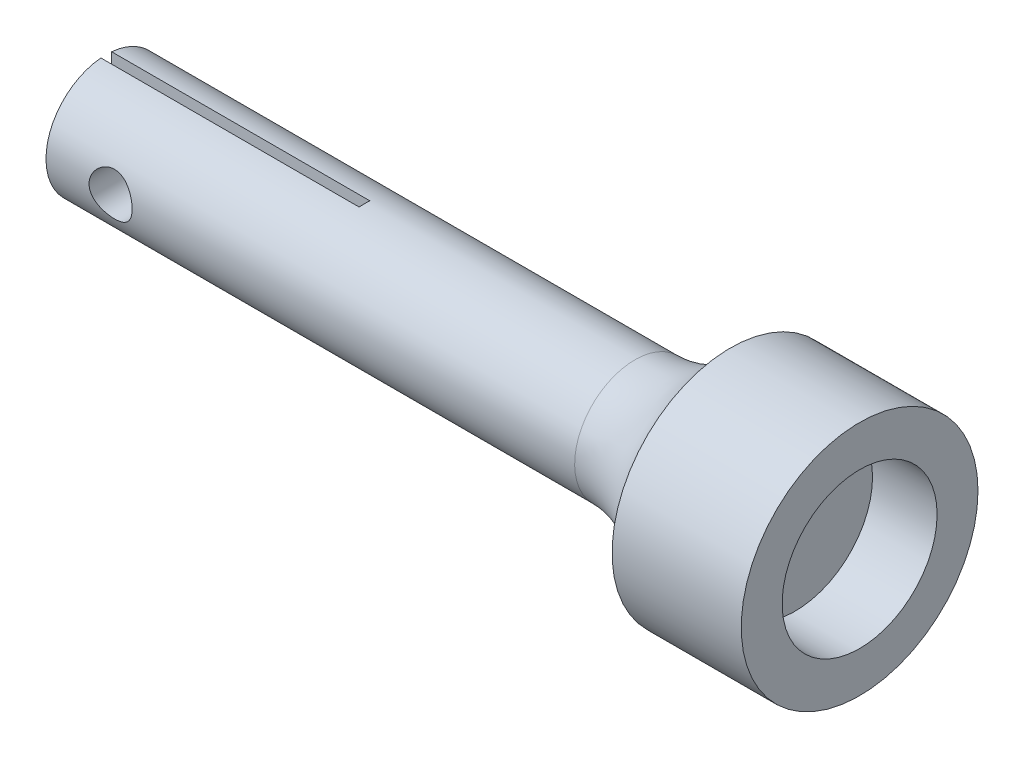
ISO-10303-21;
HEADER;
FILE_DESCRIPTION(('STEP AP214'),'2;1');
FILE_NAME('part.step','',(''),(''),'','','');
FILE_SCHEMA(('AUTOMOTIVE_DESIGN { 1 0 10303 214 1 1 1 1 }'));
ENDSEC;
DATA;
#1=APPLICATION_CONTEXT('core data for automotive mechanical design processes');
#2=APPLICATION_PROTOCOL_DEFINITION('international standard','automotive_design',2000,#1);
#3=PRODUCT_CONTEXT('',#1,'mechanical');
#4=PRODUCT('Part','Part','',(#3));
#5=PRODUCT_RELATED_PRODUCT_CATEGORY('part','',(#4));
#6=PRODUCT_DEFINITION_FORMATION('','',#4);
#7=PRODUCT_DEFINITION_CONTEXT('part definition',#1,'design');
#8=PRODUCT_DEFINITION('design','',#6,#7);
#9=PRODUCT_DEFINITION_SHAPE('','',#8);
#10=(LENGTH_UNIT() NAMED_UNIT(*) SI_UNIT(.MILLI.,.METRE.));
#11=(NAMED_UNIT(*) PLANE_ANGLE_UNIT() SI_UNIT($,.RADIAN.));
#12=(NAMED_UNIT(*) SI_UNIT($,.STERADIAN.) SOLID_ANGLE_UNIT());
#13=UNCERTAINTY_MEASURE_WITH_UNIT(LENGTH_MEASURE(1.E-05),#10,'distance_accuracy_value','');
#14=(GEOMETRIC_REPRESENTATION_CONTEXT(3) GLOBAL_UNCERTAINTY_ASSIGNED_CONTEXT((#13)) GLOBAL_UNIT_ASSIGNED_CONTEXT((#10,
#11,#12)) REPRESENTATION_CONTEXT('',''));
#15=CARTESIAN_POINT('',(0.,0.,0.));
#16=DIRECTION('',(0.,0.,1.));
#17=DIRECTION('',(1.,0.,0.));
#18=AXIS2_PLACEMENT_3D('',#15,#16,#17);
#19=CARTESIAN_POINT('',(35.,0.,0.));
#20=DIRECTION('',(-1.,0.,0.));
#21=DIRECTION('',(0.,0.,1.));
#22=AXIS2_PLACEMENT_3D('',#19,#20,#21);
#23=CYLINDRICAL_SURFACE('',#22,2.8);
#24=CARTESIAN_POINT('',(24.5604054239154,0.,0.));
#25=DIRECTION('',(1.,0.,0.));
#26=DIRECTION('',(0.,0.,-1.));
#27=AXIS2_PLACEMENT_3D('',#24,#25,#26);
#28=CIRCLE('',#27,2.8);
#29=CARTESIAN_POINT('',(24.5604054239154,0.,-2.8));
#30=VERTEX_POINT('',#29);
#31=EDGE_CURVE('E11',#30,#30,#28,.F.);
#32=ORIENTED_EDGE('',*,*,#31,.T.);
#33=EDGE_LOOP('',(#32));
#34=FACE_BOUND('',#33,.T.);
#35=CARTESIAN_POINT('',(3.99998436731162,0.,2.8));
#36=CARTESIAN_POINT('',(3.99968157578981,0.0543518119068014,2.80000081043461));
#37=CARTESIAN_POINT('',(3.99493120221083,0.108670745661306,2.79840329592013));
#38=CARTESIAN_POINT('',(3.97672801849134,0.215645712216397,2.79219764095074));
#39=CARTESIAN_POINT('',(3.96327549478635,0.268301799690549,2.78758959958872));
#40=CARTESIAN_POINT('',(3.92819384891246,0.370394931912321,2.77586854098101));
#41=CARTESIAN_POINT('',(3.90657965010624,0.419837659940304,2.76876009725596));
#42=CARTESIAN_POINT('',(3.85585668852286,0.514398858125232,2.75276162507002));
#43=CARTESIAN_POINT('',(3.82674613482375,0.55951629140507,2.74387117098934));
#44=CARTESIAN_POINT('',(3.76066402140487,0.645907642509414,2.72485405532113));
#45=CARTESIAN_POINT('',(3.72345164304428,0.686990148342238,2.71469487592134));
#46=CARTESIAN_POINT('',(3.64274444972359,0.7624801646494,2.69446733401479));
#47=CARTESIAN_POINT('',(3.5992480098622,0.796885943280569,2.68439899571488));
#48=CARTESIAN_POINT('',(3.50545226801035,0.859156411176013,2.66513603303571));
#49=CARTESIAN_POINT('',(3.45497587960342,0.886767867145321,2.65598118983054));
#50=CARTESIAN_POINT('',(3.34971586374519,0.933024564142187,2.64008862734095));
#51=CARTESIAN_POINT('',(3.2949338056644,0.951673054602365,2.63335003229552));
#52=CARTESIAN_POINT('',(3.18482701109028,0.978750063757841,2.6234043590176));
#53=CARTESIAN_POINT('',(3.12960353912714,0.987542875913959,2.62007183170028));
#54=CARTESIAN_POINT('',(3.01837248241966,0.99579233987817,2.61694844898499));
#55=CARTESIAN_POINT('',(2.9623651799449,0.995252270343698,2.61715634982812));
#56=CARTESIAN_POINT('',(2.85426317791202,0.985142713386496,2.62097654024214));
#57=CARTESIAN_POINT('',(2.80211686969965,0.976046119010187,2.6244105218601));
#58=CARTESIAN_POINT('',(2.70014348343635,0.949844721604288,2.63400601511798));
#59=CARTESIAN_POINT('',(2.65031673247883,0.932738792873097,2.64016791015597));
#60=CARTESIAN_POINT('',(2.55329801448022,0.89068208239375,2.654653746742));
#61=CARTESIAN_POINT('',(2.50617383708684,0.865588835045947,2.66301643249626));
#62=CARTESIAN_POINT('',(2.41665649131316,0.808370693938972,2.68093898406977));
#63=CARTESIAN_POINT('',(2.37426484973599,0.776243540754123,2.69049923414651));
#64=CARTESIAN_POINT('',(2.29275733225226,0.703606626544134,2.71043104768284));
#65=CARTESIAN_POINT('',(2.25398808474001,0.662710940135138,2.72081697384839));
#66=CARTESIAN_POINT('',(2.18376603857555,0.574860521164818,2.74072281614158));
#67=CARTESIAN_POINT('',(2.15231405665551,0.527905113143283,2.75024263552472));
#68=CARTESIAN_POINT('',(2.09734720948402,0.42854537729866,2.76747452658368));
#69=CARTESIAN_POINT('',(2.07392288871241,0.37608708467373,2.7751656942555));
#70=CARTESIAN_POINT('',(2.03634125488208,0.267633217083857,2.78771343248954));
#71=CARTESIAN_POINT('',(2.0221801973454,0.211639081457782,2.79257114832853));
#72=CARTESIAN_POINT('',(2.00415353730186,0.100673601060613,2.79871390692993));
#73=CARTESIAN_POINT('',(1.99981427554316,0.0457881847062376,2.8001634537073));
#74=CARTESIAN_POINT('',(2.00019784579704,-0.0639343979763133,2.79980714582579));
#75=CARTESIAN_POINT('',(2.00491898758018,-0.118771571395,2.79800189835659));
#76=CARTESIAN_POINT('',(2.02292355074018,-0.224974275261234,2.79143829309317));
#77=CARTESIAN_POINT('',(2.03592245760996,-0.276394698132204,2.78677825220942));
#78=CARTESIAN_POINT('',(2.0697521692062,-0.376295465146108,2.77505557771295));
#79=CARTESIAN_POINT('',(2.09058404277718,-0.424775406997891,2.76799261622313));
#80=CARTESIAN_POINT('',(2.14017201793885,-0.519026721666987,2.75190227512569));
#81=CARTESIAN_POINT('',(2.16914544761825,-0.564674590196989,2.74282270066413));
#82=CARTESIAN_POINT('',(2.23393707492221,-0.650607526814779,2.72372002562964));
#83=CARTESIAN_POINT('',(2.26975765177193,-0.690890722523309,2.71369659770556));
#84=CARTESIAN_POINT('',(2.34944214106111,-0.767150514500904,2.69316200711302));
#85=CARTESIAN_POINT('',(2.39362909734386,-0.802790980560569,2.68265279959909));
#86=CARTESIAN_POINT('',(2.48758799513525,-0.86619929414364,2.6628566675319));
#87=CARTESIAN_POINT('',(2.53736011997637,-0.893966883135238,2.65356978312299));
#88=CARTESIAN_POINT('',(2.64119541192047,-0.94073720528036,2.63735271703636));
#89=CARTESIAN_POINT('',(2.69525529384486,-0.959746574173525,2.63042075218332));
#90=CARTESIAN_POINT('',(2.80612159159094,-0.988283134810869,2.61983450328631));
#91=CARTESIAN_POINT('',(2.86292648084232,-0.997815534732862,2.61617841905353));
#92=CARTESIAN_POINT('',(2.97401495160832,-1.00671231476979,2.61276682213714));
#93=CARTESIAN_POINT('',(3.02824636354494,-1.00665024662565,2.61279128594208));
#94=CARTESIAN_POINT('',(3.13587826002966,-0.997787201123977,2.61618858762092));
#95=CARTESIAN_POINT('',(3.18927880092506,-0.988986819020572,2.61956119741903));
#96=CARTESIAN_POINT('',(3.2924542653526,-0.963313124287915,2.62910770204166));
#97=CARTESIAN_POINT('',(3.34228533998463,-0.946637795558853,2.63521271480446));
#98=CARTESIAN_POINT('',(3.43848046423913,-0.905850429298398,2.64950935707435));
#99=CARTESIAN_POINT('',(3.48484366134394,-0.881736570549992,2.657701497499));
#100=CARTESIAN_POINT('',(3.57530567367231,-0.825350416750248,2.67576415422859));
#101=CARTESIAN_POINT('',(3.61917464255774,-0.792729886203392,2.68569819837434));
#102=CARTESIAN_POINT('',(3.70099773474347,-0.720832904312137,2.70588113223213));
#103=CARTESIAN_POINT('',(3.73895005495113,-0.681554431548912,2.71613011678726));
#104=CARTESIAN_POINT('',(3.80967081227761,-0.595243021600092,2.73637316790833));
#105=CARTESIAN_POINT('',(3.84211149213592,-0.547932261709247,2.74633257460409));
#106=CARTESIAN_POINT('',(3.89855221977458,-0.448182174445977,2.76436212124485));
#107=CARTESIAN_POINT('',(3.92255299527647,-0.395743289739085,2.77243242405569));
#108=CARTESIAN_POINT('',(3.96131269372733,-0.287042377529552,2.78578705111332));
#109=CARTESIAN_POINT('',(3.9760469832864,-0.230770596813872,2.79106394371281));
#110=CARTESIAN_POINT('',(3.99554284513281,-0.116319506472419,2.79816931898325));
#111=CARTESIAN_POINT('',(4.00030826790924,-0.0581409421668658,2.79999913306604));
#112=CARTESIAN_POINT('',(3.99998436731162,0.,2.8));
#113=B_SPLINE_CURVE_WITH_KNOTS('',3,(#35,#36,#37,#38,#39,#40,#41,#42,#43,#44,#45,#46,#47,#48,
#49,#50,#51,#52,#53,#54,#55,#56,#57,#58,#59,#60,#61,#62,#63,#64,#65,#66,#67,#68,#69,#70,#71,#72,
#73,#74,#75,#76,#77,#78,#79,#80,#81,#82,#83,#84,#85,#86,#87,#88,#89,#90,#91,#92,#93,#94,#95,#96,
#97,#98,#99,#100,#101,#102,#103,#104,#105,#106,#107,#108,#109,#110,#111,#112),.UNSPECIFIED.,.T.,
.F.,(4,2,2,2,2,2,2,2,2,2,2,2,2,2,2,2,2,2,2,2,2,2,2,2,2,2,2,2,2,2,2,2,2,2,2,2,2,2,4),(0.,
0.162843557305116,0.325681754807981,0.488223638394486,0.650804390248843,0.819113031204537,
0.987465270721624,1.16137140415672,1.33521444203292,1.50239486537706,1.66951655914443,
1.82791292177261,1.98633155349074,2.14775108278828,2.30922253941272,2.48033340734969,
2.6514633650372,2.82446445545257,2.9973955705552,3.16179123869065,3.32615624159304,
3.4851561495556,3.64417776166905,3.807930738127,3.97174071872958,4.14413158406509,
4.31652810976606,4.48879380210899,4.66096477143157,4.8228476897164,4.98471958128999,
5.14272246794914,5.3007640700862,5.46672421328524,5.63273483421593,5.80655322867135,
5.98035663214837,6.15462013111838,6.32881630812455),.UNSPECIFIED.);
#114=CARTESIAN_POINT('',(3.99998436731162,0.,2.8));
#115=VERTEX_POINT('',#114);
#116=EDGE_CURVE('E96',#115,#115,#113,.T.);
#117=ORIENTED_EDGE('',*,*,#116,.F.);
#118=EDGE_LOOP('',(#117));
#119=FACE_BOUND('',#118,.T.);
#120=CARTESIAN_POINT('',(3.,-1.00559152326157,-2.61319453702637));
#121=CARTESIAN_POINT('',(2.94581583625714,-1.00559270417088,-2.61319350172991));
#122=CARTESIAN_POINT('',(2.89163980981088,-1.0011728147267,-2.61490763309015));
#123=CARTESIAN_POINT('',(2.78490961253958,-0.983681867070271,-2.62153695344931));
#124=CARTESIAN_POINT('',(2.73235552558098,-0.970610362286356,-2.62645230768602));
#125=CARTESIAN_POINT('',(2.63043727910103,-0.936348777699535,-2.63885935029053));
#126=CARTESIAN_POINT('',(2.58106631483222,-0.915176736101611,-2.6463453106857));
#127=CARTESIAN_POINT('',(2.48655969014907,-0.865378722993564,-2.66304469726641));
#128=CARTESIAN_POINT('',(2.44142517396796,-0.836750745526424,-2.67225858815012));
#129=CARTESIAN_POINT('',(2.35462013812696,-0.771460142820544,-2.69184985809865));
#130=CARTESIAN_POINT('',(2.31316981183983,-0.734514402936533,-2.70225958128236));
#131=CARTESIAN_POINT('',(2.23690015737999,-0.654240023266012,-2.72280826557513));
#132=CARTESIAN_POINT('',(2.20208210853297,-0.610910154873144,-2.73294717412207));
#133=CARTESIAN_POINT('',(2.13901665355336,-0.517434282381749,-2.75220011140442));
#134=CARTESIAN_POINT('',(2.11100781331546,-0.467117949852621,-2.7612723570996));
#135=CARTESIAN_POINT('',(2.06394225927365,-0.362107127486806,-2.77699323559544));
#136=CARTESIAN_POINT('',(2.04488276437741,-0.307414003970724,-2.78364262117836));
#137=CARTESIAN_POINT('',(2.01701242918521,-0.197484492534624,-2.79355044094607));
#138=CARTESIAN_POINT('',(2.00782777354089,-0.142354193926773,-2.79693202708521));
#139=CARTESIAN_POINT('',(1.99877729289326,-0.0312377196610274,-2.80037677712182));
#140=CARTESIAN_POINT('',(1.99890868022344,0.0247481949550353,-2.80044093369342));
#141=CARTESIAN_POINT('',(2.00826096500762,0.133282843918552,-2.79732935366024));
#142=CARTESIAN_POINT('',(2.01706858719283,0.185872168615696,-2.79430069703106));
#143=CARTESIAN_POINT('',(2.04283603404691,0.288773892081078,-2.78554796736443));
#144=CARTESIAN_POINT('',(2.05979640643675,0.339086137621256,-2.77982371323091));
#145=CARTESIAN_POINT('',(2.10158648082716,0.436806186236417,-2.76616507114798));
#146=CARTESIAN_POINT('',(2.12651861857964,0.484166017280522,-2.75820208633761));
#147=CARTESIAN_POINT('',(2.18345639759157,0.574144066234325,-2.74088690814369));
#148=CARTESIAN_POINT('',(2.21546417684764,0.616760845105184,-2.73153429514665));
#149=CARTESIAN_POINT('',(2.28763997527333,0.698446229897507,-2.71183187226936));
#150=CARTESIAN_POINT('',(2.32815168295294,0.737205196358174,-2.70145548159697));
#151=CARTESIAN_POINT('',(2.41516997071013,0.807490780085563,-2.68128678808209));
#152=CARTESIAN_POINT('',(2.4616777796901,0.839015911083988,-2.67149460557665));
#153=CARTESIAN_POINT('',(2.560501642775,0.894469482740631,-2.65344941366636));
#154=CARTESIAN_POINT('',(2.61291038601647,0.918244110773872,-2.64522876965292));
#155=CARTESIAN_POINT('',(2.72135430606839,0.956519953145428,-2.63163201231884));
#156=CARTESIAN_POINT('',(2.77738770278769,0.971025681992695,-2.62625451443638));
#157=CARTESIAN_POINT('',(2.88848465203628,0.989685552010179,-2.61927802723335));
#158=CARTESIAN_POINT('',(2.94345611510576,0.994321963840302,-2.61750320830803));
#159=CARTESIAN_POINT('',(3.05340854706268,0.994492532208805,-2.61743871113679));
#160=CARTESIAN_POINT('',(3.10838951131316,0.990028659797159,-2.61914827820025));
#161=CARTESIAN_POINT('',(3.21443819750368,0.972563142392776,-2.62568097412891));
#162=CARTESIAN_POINT('',(3.26557388995844,0.959919783572844,-2.63037330504923));
#163=CARTESIAN_POINT('',(3.36498124362321,0.926896175180284,-2.64219016449614));
#164=CARTESIAN_POINT('',(3.41325235268755,0.906514439607749,-2.64931516014066));
#165=CARTESIAN_POINT('',(3.50741989871313,0.857792843182706,-2.66549625668178));
#166=CARTESIAN_POINT('',(3.55317586130003,0.829201433422258,-2.67461077536913));
#167=CARTESIAN_POINT('',(3.63941497507502,0.765145681149404,-2.69363449446803));
#168=CARTESIAN_POINT('',(3.67989636462694,0.729679052195342,-2.70354395860439));
#169=CARTESIAN_POINT('',(3.75677634599647,0.650533012879929,-2.72370389099987));
#170=CARTESIAN_POINT('',(3.79282110874337,0.606505777201771,-2.73394253594371));
#171=CARTESIAN_POINT('',(3.85704438339149,0.51277296595146,-2.75306166446986));
#172=CARTESIAN_POINT('',(3.88522305893423,0.463067508536061,-2.76194217630425));
#173=CARTESIAN_POINT('',(3.93267869901535,0.359555966017418,-2.77730783962885));
#174=CARTESIAN_POINT('',(3.95200424818753,0.305774196512696,-2.78380602469255));
#175=CARTESIAN_POINT('',(3.98124317979562,0.195443366698758,-2.79371860186559));
#176=CARTESIAN_POINT('',(3.99116050618007,0.138895476416939,-2.79713428613706));
#177=CARTESIAN_POINT('',(4.00090916452853,0.0278752377949744,-2.800382703917));
#178=CARTESIAN_POINT('',(4.00124864302162,-0.0265476422700681,-2.80039625487239));
#179=CARTESIAN_POINT('',(3.99311850413936,-0.134634345788297,-2.7972836544234));
#180=CARTESIAN_POINT('',(3.98464975888394,-0.188298243856622,-2.79415781385753));
#181=CARTESIAN_POINT('',(3.95948936254632,-0.292271808644652,-2.78518384801456));
#182=CARTESIAN_POINT('',(3.94296439424765,-0.342626929395226,-2.77939103205515));
#183=CARTESIAN_POINT('',(3.90232475319611,-0.439858887059174,-2.76567127132179));
#184=CARTESIAN_POINT('',(3.87820864243641,-0.486735062867502,-2.7577439222397));
#185=CARTESIAN_POINT('',(3.82195325274469,-0.577754236561894,-2.7401525879918));
#186=CARTESIAN_POINT('',(3.78952845547638,-0.621709505230371,-2.7304312472909));
#187=CARTESIAN_POINT('',(3.71804120950852,-0.703716177371167,-2.71045533139659));
#188=CARTESIAN_POINT('',(3.67897647527818,-0.741765539316079,-2.70020057344208));
#189=CARTESIAN_POINT('',(3.59313968988683,-0.812701931597102,-2.67972822818928));
#190=CARTESIAN_POINT('',(3.54609267954779,-0.845264419518674,-2.66953479607693));
#191=CARTESIAN_POINT('',(3.44686746397306,-0.902014866716016,-2.65089893580727));
#192=CARTESIAN_POINT('',(3.39468963294208,-0.926203436143617,-2.64245638009321));
#193=CARTESIAN_POINT('',(3.28642525889691,-0.965427037408501,-2.62838171109017));
#194=CARTESIAN_POINT('',(3.23032657109095,-0.980432084042105,-2.62275881497867));
#195=CARTESIAN_POINT('',(3.11614812614243,-1.00051117323216,-2.61516671017253));
#196=CARTESIAN_POINT('',(3.05806939002659,-1.00559025767622,-2.61319564655783));
#197=CARTESIAN_POINT('',(3.,-1.00559152326157,-2.61319453702637));
#198=B_SPLINE_CURVE_WITH_KNOTS('',3,(#120,#121,#122,#123,#124,#125,#126,#127,#128,#129,#130,
#131,#132,#133,#134,#135,#136,#137,#138,#139,#140,#141,#142,#143,#144,#145,#146,#147,#148,#149,
#150,#151,#152,#153,#154,#155,#156,#157,#158,#159,#160,#161,#162,#163,#164,#165,#166,#167,#168,
#169,#170,#171,#172,#173,#174,#175,#176,#177,#178,#179,#180,#181,#182,#183,#184,#185,#186,#187,
#188,#189,#190,#191,#192,#193,#194,#195,#196,#197),.UNSPECIFIED.,.T.,.F.,(4,2,2,2,2,2,2,2,2,2,2,
2,2,2,2,2,2,2,2,2,2,2,2,2,2,2,2,2,2,2,2,2,2,2,2,2,2,2,4),(0.,0.162336658737832,
0.324681697483818,0.486667312136147,0.648696552760548,0.81742086330462,0.986177686850149,
1.16019332511253,1.33415485054799,1.5012701361034,1.66833541547889,1.82780967733409,
1.98729465454365,2.14891742174606,2.31058909227492,2.48086691437704,2.65117969060198,
2.82469148835613,2.99811871092679,3.16285595025152,3.32755751257701,3.48549273900939,
3.6434583090834,3.80690391824585,3.97040397686721,4.143026663558,4.31564575883875,
4.48730585118671,4.65889395139076,4.82136040373214,4.98381077147512,5.14303419859135,
5.30228780592206,5.46799476541774,5.63375887879514,5.80727330379643,5.98077508329162,
6.15484038419645,6.32881724571261),.UNSPECIFIED.);
#199=CARTESIAN_POINT('',(3.,-1.00559152326157,-2.61319453702637));
#200=VERTEX_POINT('',#199);
#201=EDGE_CURVE('E115',#200,#200,#198,.T.);
#202=ORIENTED_EDGE('',*,*,#201,.F.);
#203=EDGE_LOOP('',(#202));
#204=FACE_BOUND('',#203,.T.);
#205=CARTESIAN_POINT('',(0.,0.,0.));
#206=DIRECTION('',(1.,0.,0.));
#207=DIRECTION('',(0.,0.,-1.));
#208=AXIS2_PLACEMENT_3D('',#205,#206,#207);
#209=CIRCLE('',#208,2.8);
#210=CARTESIAN_POINT('',(0.,2.78881695347687,0.25));
#211=VERTEX_POINT('',#210);
#212=CARTESIAN_POINT('',(0.,2.78881695347687,-0.25));
#213=VERTEX_POINT('',#212);
#214=EDGE_CURVE('E104',#211,#213,#209,.T.);
#215=ORIENTED_EDGE('',*,*,#214,.T.);
#216=DIRECTION('',(-1.,0.,0.));
#217=VECTOR('',#216,1.);
#218=CARTESIAN_POINT('',(35.,2.78881695347687,-0.25));
#219=LINE('',#218,#217);
#220=CARTESIAN_POINT('',(12.,2.78881695347687,-0.25));
#221=VERTEX_POINT('',#220);
#222=EDGE_CURVE('E102',#213,#221,#219,.F.);
#223=ORIENTED_EDGE('',*,*,#222,.T.);
#224=CARTESIAN_POINT('',(12.,0.,0.));
#225=DIRECTION('',(-1.,0.,0.));
#226=DIRECTION('',(0.,0.,1.));
#227=AXIS2_PLACEMENT_3D('',#224,#225,#226);
#228=CIRCLE('',#227,2.8);
#229=CARTESIAN_POINT('',(12.,2.78881695347687,0.25));
#230=VERTEX_POINT('',#229);
#231=EDGE_CURVE('E41',#230,#221,#228,.T.);
#232=ORIENTED_EDGE('',*,*,#231,.F.);
#233=DIRECTION('',(-1.,0.,0.));
#234=VECTOR('',#233,1.);
#235=CARTESIAN_POINT('',(35.,2.78881695347687,0.25));
#236=LINE('',#235,#234);
#237=EDGE_CURVE('E98',#230,#211,#236,.T.);
#238=ORIENTED_EDGE('',*,*,#237,.T.);
#239=EDGE_LOOP('',(#215,#223,#232,#238));
#240=FACE_BOUND('',#239,.T.);
#241=ADVANCED_FACE('F33',(#34,#119,#204,#240),#23,.T.);
#242=CARTESIAN_POINT('',(0.,0.,0.));
#243=DIRECTION('',(1.,0.,0.));
#244=DIRECTION('',(0.,0.,-1.));
#245=AXIS2_PLACEMENT_3D('',#242,#243,#244);
#246=PLANE('',#245);
#247=DIRECTION('',(0.,0.,1.));
#248=VECTOR('',#247,1.);
#249=CARTESIAN_POINT('',(0.,-2.32901081224555,-0.249999999999999));
#250=LINE('',#249,#248);
#251=CARTESIAN_POINT('',(0.,-2.32901081224555,-0.249999999999999));
#252=VERTEX_POINT('',#251);
#253=CARTESIAN_POINT('',(0.,-2.32901081224555,0.250000000000001));
#254=VERTEX_POINT('',#253);
#255=EDGE_CURVE('E94',#252,#254,#250,.T.);
#256=ORIENTED_EDGE('',*,*,#255,.F.);
#257=DIRECTION('',(0.,1.,0.));
#258=VECTOR('',#257,1.);
#259=CARTESIAN_POINT('',(0.,0.,-0.25));
#260=LINE('',#259,#258);
#261=EDGE_CURVE('E83',#252,#213,#260,.T.);
#262=ORIENTED_EDGE('',*,*,#261,.T.);
#263=ORIENTED_EDGE('',*,*,#214,.F.);
#264=DIRECTION('',(0.,1.,0.));
#265=VECTOR('',#264,1.);
#266=CARTESIAN_POINT('',(0.,3.12152143585721,0.25));
#267=LINE('',#266,#265);
#268=EDGE_CURVE('E79',#254,#211,#267,.T.);
#269=ORIENTED_EDGE('',*,*,#268,.F.);
#270=EDGE_LOOP('',(#256,#262,#263,#269));
#271=FACE_BOUND('',#270,.T.);
#272=ADVANCED_FACE('F150',(#271),#246,.F.);
#273=CARTESIAN_POINT('',(12.,0.,0.));
#274=DIRECTION('',(-1.,0.,0.));
#275=DIRECTION('',(0.,0.,1.));
#276=AXIS2_PLACEMENT_3D('',#273,#274,#275);
#277=PLANE('',#276);
#278=ORIENTED_EDGE('',*,*,#231,.T.);
#279=DIRECTION('',(0.,-1.,0.));
#280=VECTOR('',#279,1.);
#281=CARTESIAN_POINT('',(12.,3.12152143585721,-0.25));
#282=LINE('',#281,#280);
#283=CARTESIAN_POINT('',(12.,-2.32901081224555,-0.249999999999999));
#284=VERTEX_POINT('',#283);
#285=EDGE_CURVE('E74',#221,#284,#282,.T.);
#286=ORIENTED_EDGE('',*,*,#285,.T.);
#287=DIRECTION('',(0.,0.,1.));
#288=VECTOR('',#287,1.);
#289=CARTESIAN_POINT('',(12.,-2.32901081224555,-0.249999999999999));
#290=LINE('',#289,#288);
#291=CARTESIAN_POINT('',(12.,-2.32901081224555,0.250000000000001));
#292=VERTEX_POINT('',#291);
#293=EDGE_CURVE('E76',#284,#292,#290,.T.);
#294=ORIENTED_EDGE('',*,*,#293,.T.);
#295=DIRECTION('',(0.,1.,0.));
#296=VECTOR('',#295,1.);
#297=CARTESIAN_POINT('',(12.,3.12152143585721,0.25));
#298=LINE('',#297,#296);
#299=EDGE_CURVE('E86',#292,#230,#298,.T.);
#300=ORIENTED_EDGE('',*,*,#299,.T.);
#301=EDGE_LOOP('',(#278,#286,#294,#300));
#302=FACE_BOUND('',#301,.T.);
#303=ADVANCED_FACE('F75',(#302),#277,.T.);
#304=CARTESIAN_POINT('',(12.,3.12152143585721,-0.25));
#305=DIRECTION('',(0.,0.,-1.));
#306=DIRECTION('',(0.,1.,0.));
#307=AXIS2_PLACEMENT_3D('',#304,#305,#306);
#308=PLANE('',#307);
#309=CARTESIAN_POINT('',(3.,-0.00559152326156615,-0.25));
#310=DIRECTION('',(0.,0.,-1.));
#311=DIRECTION('',(0.,1.,0.));
#312=AXIS2_PLACEMENT_3D('',#309,#310,#311);
#313=CIRCLE('',#312,1.);
#314=CARTESIAN_POINT('',(3.,0.994408476738434,-0.25));
#315=VERTEX_POINT('',#314);
#316=EDGE_CURVE('E110',#315,#315,#313,.F.);
#317=ORIENTED_EDGE('',*,*,#316,.F.);
#318=EDGE_LOOP('',(#317));
#319=FACE_BOUND('',#318,.T.);
#320=ORIENTED_EDGE('',*,*,#261,.F.);
#321=DIRECTION('',(-1.,0.,0.));
#322=VECTOR('',#321,1.);
#323=CARTESIAN_POINT('',(12.,-2.32901081224555,-0.249999999999999));
#324=LINE('',#323,#322);
#325=EDGE_CURVE('E48',#284,#252,#324,.T.);
#326=ORIENTED_EDGE('',*,*,#325,.F.);
#327=ORIENTED_EDGE('',*,*,#285,.F.);
#328=ORIENTED_EDGE('',*,*,#222,.F.);
#329=EDGE_LOOP('',(#320,#326,#327,#328));
#330=FACE_BOUND('',#329,.T.);
#331=ADVANCED_FACE('F81',(#319,#330),#308,.F.);
#332=CARTESIAN_POINT('',(12.,3.12152143585721,0.25));
#333=DIRECTION('',(0.,0.,1.));
#334=DIRECTION('',(0.,-1.,0.));
#335=AXIS2_PLACEMENT_3D('',#332,#333,#334);
#336=PLANE('',#335);
#337=CARTESIAN_POINT('',(3.,-0.00559152326156609,0.25));
#338=DIRECTION('',(0.,0.,1.));
#339=DIRECTION('',(0.,-1.,0.));
#340=AXIS2_PLACEMENT_3D('',#337,#338,#339);
#341=CIRCLE('',#340,1.);
#342=CARTESIAN_POINT('',(3.,-1.00559152326157,0.25));
#343=VERTEX_POINT('',#342);
#344=EDGE_CURVE('E108',#343,#343,#341,.F.);
#345=ORIENTED_EDGE('',*,*,#344,.F.);
#346=EDGE_LOOP('',(#345));
#347=FACE_BOUND('',#346,.T.);
#348=ORIENTED_EDGE('',*,*,#299,.F.);
#349=DIRECTION('',(-1.,0.,0.));
#350=VECTOR('',#349,1.);
#351=CARTESIAN_POINT('',(12.,-2.32901081224555,0.250000000000001));
#352=LINE('',#351,#350);
#353=EDGE_CURVE('E85',#292,#254,#352,.T.);
#354=ORIENTED_EDGE('',*,*,#353,.T.);
#355=ORIENTED_EDGE('',*,*,#268,.T.);
#356=ORIENTED_EDGE('',*,*,#237,.F.);
#357=EDGE_LOOP('',(#348,#354,#355,#356));
#358=FACE_BOUND('',#357,.T.);
#359=ADVANCED_FACE('F151',(#347,#358),#336,.F.);
#360=CARTESIAN_POINT('',(12.,-2.32901081224555,-0.249999999999999));
#361=DIRECTION('',(0.,-1.,0.));
#362=DIRECTION('',(0.,0.,-1.));
#363=AXIS2_PLACEMENT_3D('',#360,#361,#362);
#364=PLANE('',#363);
#365=ORIENTED_EDGE('',*,*,#255,.T.);
#366=ORIENTED_EDGE('',*,*,#353,.F.);
#367=ORIENTED_EDGE('',*,*,#293,.F.);
#368=ORIENTED_EDGE('',*,*,#325,.T.);
#369=EDGE_LOOP('',(#365,#366,#367,#368));
#370=FACE_BOUND('',#369,.T.);
#371=ADVANCED_FACE('F88',(#370),#364,.F.);
#372=CARTESIAN_POINT('',(3.,-0.00559152326156729,-9.75));
#373=DIRECTION('',(0.,0.,1.));
#374=DIRECTION('',(0.,-1.,0.));
#375=AXIS2_PLACEMENT_3D('',#372,#373,#374);
#376=CYLINDRICAL_SURFACE('',#375,1.);
#377=ORIENTED_EDGE('',*,*,#344,.T.);
#378=EDGE_LOOP('',(#377));
#379=FACE_BOUND('',#378,.T.);
#380=ORIENTED_EDGE('',*,*,#116,.T.);
#381=EDGE_LOOP('',(#380));
#382=FACE_BOUND('',#381,.T.);
#383=ADVANCED_FACE('F139',(#379,#382),#376,.F.);
#384=ORIENTED_EDGE('',*,*,#316,.T.);
#385=EDGE_LOOP('',(#384));
#386=FACE_BOUND('',#385,.T.);
#387=ORIENTED_EDGE('',*,*,#201,.T.);
#388=EDGE_LOOP('',(#387));
#389=FACE_BOUND('',#388,.T.);
#390=ADVANCED_FACE('F144',(#386,#389),#376,.F.);
#391=CARTESIAN_POINT('',(29.,0.,0.));
#392=DIRECTION('',(1.,0.,0.));
#393=DIRECTION('',(0.,0.,-1.));
#394=AXIS2_PLACEMENT_3D('',#391,#392,#393);
#395=CYLINDRICAL_SURFACE('',#394,5.5);
#396=CARTESIAN_POINT('',(29.,0.,0.));
#397=DIRECTION('',(1.,0.,0.));
#398=DIRECTION('',(0.,0.,-1.));
#399=AXIS2_PLACEMENT_3D('',#396,#397,#398);
#400=CIRCLE('',#399,5.5);
#401=CARTESIAN_POINT('',(29.,0.,-5.5));
#402=VERTEX_POINT('',#401);
#403=EDGE_CURVE('E111',#402,#402,#400,.T.);
#404=ORIENTED_EDGE('',*,*,#403,.T.);
#405=EDGE_LOOP('',(#404));
#406=FACE_BOUND('',#405,.T.);
#407=CARTESIAN_POINT('',(35.,0.,0.));
#408=DIRECTION('',(1.,0.,0.));
#409=DIRECTION('',(0.,0.,-1.));
#410=AXIS2_PLACEMENT_3D('',#407,#408,#409);
#411=CIRCLE('',#410,5.5);
#412=CARTESIAN_POINT('',(35.,0.,-5.5));
#413=VERTEX_POINT('',#412);
#414=EDGE_CURVE('E118',#413,#413,#411,.T.);
#415=ORIENTED_EDGE('',*,*,#414,.F.);
#416=EDGE_LOOP('',(#415));
#417=FACE_BOUND('',#416,.T.);
#418=ADVANCED_FACE('F145',(#406,#417),#395,.T.);
#419=CARTESIAN_POINT('',(35.,0.,0.));
#420=DIRECTION('',(1.,0.,0.));
#421=DIRECTION('',(0.,0.,-1.));
#422=AXIS2_PLACEMENT_3D('',#419,#420,#421);
#423=PLANE('',#422);
#424=CARTESIAN_POINT('',(35.,0.,0.));
#425=DIRECTION('',(1.,0.,0.));
#426=DIRECTION('',(0.,0.,-1.));
#427=AXIS2_PLACEMENT_3D('',#424,#425,#426);
#428=CIRCLE('',#427,3.6);
#429=CARTESIAN_POINT('',(35.,0.,-3.6));
#430=VERTEX_POINT('',#429);
#431=EDGE_CURVE('E126',#430,#430,#428,.T.);
#432=ORIENTED_EDGE('',*,*,#431,.F.);
#433=EDGE_LOOP('',(#432));
#434=FACE_BOUND('',#433,.T.);
#435=ORIENTED_EDGE('',*,*,#414,.T.);
#436=EDGE_LOOP('',(#435));
#437=FACE_BOUND('',#436,.T.);
#438=ADVANCED_FACE('F160',(#434,#437),#423,.T.);
#439=CARTESIAN_POINT('',(32.,0.,0.));
#440=DIRECTION('',(1.,0.,0.));
#441=DIRECTION('',(0.,0.,-1.));
#442=AXIS2_PLACEMENT_3D('',#439,#440,#441);
#443=CYLINDRICAL_SURFACE('',#442,3.6);
#444=CARTESIAN_POINT('',(32.,0.,0.));
#445=DIRECTION('',(1.,0.,0.));
#446=DIRECTION('',(0.,0.,-1.));
#447=AXIS2_PLACEMENT_3D('',#444,#445,#446);
#448=CIRCLE('',#447,3.6);
#449=CARTESIAN_POINT('',(32.,0.,-3.6));
#450=VERTEX_POINT('',#449);
#451=EDGE_CURVE('E123',#450,#450,#448,.T.);
#452=ORIENTED_EDGE('',*,*,#451,.F.);
#453=EDGE_LOOP('',(#452));
#454=FACE_BOUND('',#453,.T.);
#455=ORIENTED_EDGE('',*,*,#431,.T.);
#456=EDGE_LOOP('',(#455));
#457=FACE_BOUND('',#456,.T.);
#458=ADVANCED_FACE('F162',(#454,#457),#443,.F.);
#459=CARTESIAN_POINT('',(32.,0.,0.));
#460=DIRECTION('',(1.,0.,0.));
#461=DIRECTION('',(0.,0.,-1.));
#462=AXIS2_PLACEMENT_3D('',#459,#460,#461);
#463=PLANE('',#462);
#464=ORIENTED_EDGE('',*,*,#451,.T.);
#465=EDGE_LOOP('',(#464));
#466=FACE_BOUND('',#465,.T.);
#467=ADVANCED_FACE('F204',(#466),#463,.T.);
#468=CARTESIAN_POINT('',(24.5604054239154,0.,0.));
#469=DIRECTION('',(1.,0.,0.));
#470=DIRECTION('',(0.,0.,-1.));
#471=AXIS2_PLACEMENT_3D('',#468,#469,#470);
#472=TOROIDAL_SURFACE('',#471,7.8,5.);
#473=ORIENTED_EDGE('',*,*,#31,.F.);
#474=EDGE_LOOP('',(#473));
#475=FACE_BOUND('',#474,.T.);
#476=ORIENTED_EDGE('',*,*,#403,.F.);
#477=EDGE_LOOP('',(#476));
#478=FACE_BOUND('',#477,.T.);
#479=ADVANCED_FACE('F35',(#475,#478),#472,.F.);
#480=CLOSED_SHELL('',(#241,#272,#303,#331,#359,#371,#383,#390,#418,#438,#458,#467,#479));
#481=MANIFOLD_SOLID_BREP('B2',#480);
#482=ADVANCED_BREP_SHAPE_REPRESENTATION('',(#18,#481),#14);
#483=SHAPE_DEFINITION_REPRESENTATION(#9,#482);
ENDSEC;
END-ISO-10303-21;
